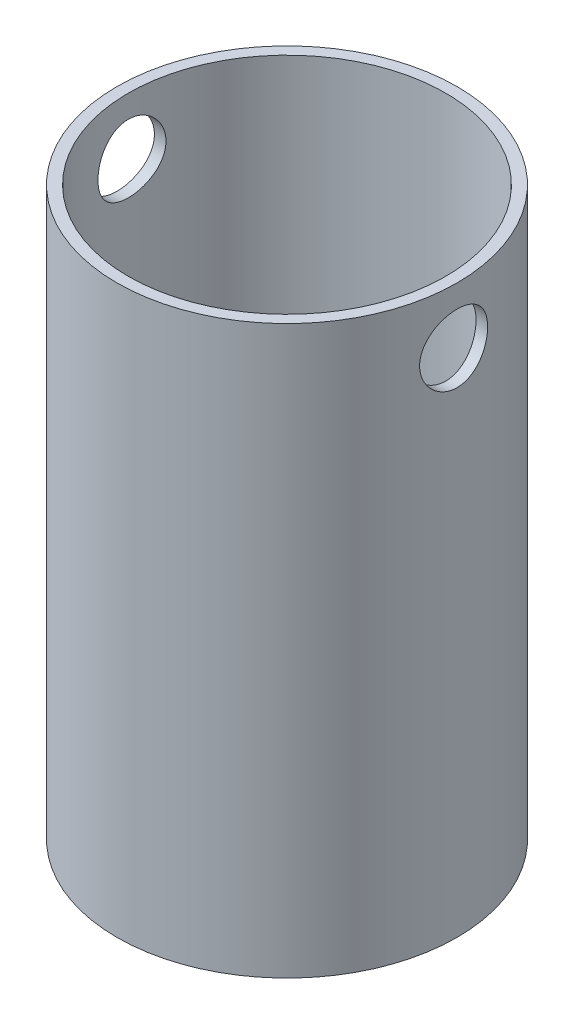
ISO-10303-21;
HEADER;
FILE_DESCRIPTION(('STEP AP214'),'2;1');
FILE_NAME('part.step','',(''),(''),'','','');
FILE_SCHEMA(('AUTOMOTIVE_DESIGN { 1 0 10303 214 1 1 1 1 }'));
ENDSEC;
DATA;
#1=APPLICATION_CONTEXT('core data for automotive mechanical design processes');
#2=APPLICATION_PROTOCOL_DEFINITION('international standard','automotive_design',2000,#1);
#3=PRODUCT_CONTEXT('',#1,'mechanical');
#4=PRODUCT('Part','Part','',(#3));
#5=PRODUCT_RELATED_PRODUCT_CATEGORY('part','',(#4));
#6=PRODUCT_DEFINITION_FORMATION('','',#4);
#7=PRODUCT_DEFINITION_CONTEXT('part definition',#1,'design');
#8=PRODUCT_DEFINITION('design','',#6,#7);
#9=PRODUCT_DEFINITION_SHAPE('','',#8);
#10=(LENGTH_UNIT() NAMED_UNIT(*) SI_UNIT(.MILLI.,.METRE.));
#11=(NAMED_UNIT(*) PLANE_ANGLE_UNIT() SI_UNIT($,.RADIAN.));
#12=(NAMED_UNIT(*) SI_UNIT($,.STERADIAN.) SOLID_ANGLE_UNIT());
#13=UNCERTAINTY_MEASURE_WITH_UNIT(LENGTH_MEASURE(1.E-05),#10,'distance_accuracy_value','');
#14=(GEOMETRIC_REPRESENTATION_CONTEXT(3) GLOBAL_UNCERTAINTY_ASSIGNED_CONTEXT((#13)) GLOBAL_UNIT_ASSIGNED_CONTEXT((#10,
#11,#12)) REPRESENTATION_CONTEXT('',''));
#15=CARTESIAN_POINT('',(0.,0.,0.));
#16=DIRECTION('',(0.,0.,1.));
#17=DIRECTION('',(1.,0.,0.));
#18=AXIS2_PLACEMENT_3D('',#15,#16,#17);
#19=CARTESIAN_POINT('',(0.,50.,0.));
#20=DIRECTION('',(0.,1.,0.));
#21=DIRECTION('',(0.,0.,1.));
#22=AXIS2_PLACEMENT_3D('',#19,#20,#21);
#23=PLANE('',#22);
#24=CARTESIAN_POINT('',(0.,50.,0.));
#25=DIRECTION('',(0.,1.,0.));
#26=DIRECTION('',(0.,0.,1.));
#27=AXIS2_PLACEMENT_3D('',#24,#25,#26);
#28=CIRCLE('',#27,15.);
#29=CARTESIAN_POINT('',(0.,50.,15.));
#30=VERTEX_POINT('',#29);
#31=EDGE_CURVE('E10',#30,#30,#28,.T.);
#32=ORIENTED_EDGE('',*,*,#31,.T.);
#33=EDGE_LOOP('',(#32));
#34=FACE_BOUND('',#33,.T.);
#35=CARTESIAN_POINT('',(0.,50.,0.));
#36=DIRECTION('',(0.,1.,0.));
#37=DIRECTION('',(0.,0.,1.));
#38=AXIS2_PLACEMENT_3D('',#35,#36,#37);
#39=CIRCLE('',#38,14.);
#40=CARTESIAN_POINT('',(0.,50.,14.));
#41=VERTEX_POINT('',#40);
#42=EDGE_CURVE('E59',#41,#41,#39,.T.);
#43=ORIENTED_EDGE('',*,*,#42,.F.);
#44=EDGE_LOOP('',(#43));
#45=FACE_BOUND('',#44,.T.);
#46=ADVANCED_FACE('F40',(#34,#45),#23,.T.);
#47=CARTESIAN_POINT('',(0.,0.,0.));
#48=DIRECTION('',(0.,1.,0.));
#49=DIRECTION('',(0.,0.,1.));
#50=AXIS2_PLACEMENT_3D('',#47,#48,#49);
#51=PLANE('',#50);
#52=CARTESIAN_POINT('',(0.,0.,0.));
#53=DIRECTION('',(0.,1.,0.));
#54=DIRECTION('',(0.,0.,1.));
#55=AXIS2_PLACEMENT_3D('',#52,#53,#54);
#56=CIRCLE('',#55,15.);
#57=CARTESIAN_POINT('',(0.,0.,15.));
#58=VERTEX_POINT('',#57);
#59=EDGE_CURVE('E54',#58,#58,#56,.T.);
#60=ORIENTED_EDGE('',*,*,#59,.F.);
#61=EDGE_LOOP('',(#60));
#62=FACE_BOUND('',#61,.T.);
#63=CARTESIAN_POINT('',(0.,0.,0.));
#64=DIRECTION('',(0.,1.,0.));
#65=DIRECTION('',(0.,0.,1.));
#66=AXIS2_PLACEMENT_3D('',#63,#64,#65);
#67=CIRCLE('',#66,14.);
#68=CARTESIAN_POINT('',(0.,0.,14.));
#69=VERTEX_POINT('',#68);
#70=EDGE_CURVE('E62',#69,#69,#67,.T.);
#71=ORIENTED_EDGE('',*,*,#70,.T.);
#72=EDGE_LOOP('',(#71));
#73=FACE_BOUND('',#72,.T.);
#74=ADVANCED_FACE('F98',(#62,#73),#51,.F.);
#75=CARTESIAN_POINT('',(0.,50.,0.));
#76=DIRECTION('',(0.,-1.,0.));
#77=DIRECTION('',(0.,0.,-1.));
#78=AXIS2_PLACEMENT_3D('',#75,#76,#77);
#79=CYLINDRICAL_SURFACE('',#78,15.);
#80=CARTESIAN_POINT('',(-15.,42.,0.));
#81=CARTESIAN_POINT('',(-14.9999969274261,42.000006133495,-0.1667307203779));
#82=CARTESIAN_POINT('',(-14.9971915553469,42.0139465289029,-0.333538980604568));
#83=CARTESIAN_POINT('',(-14.9862709686969,42.0692955003457,-0.662440523067059));
#84=CARTESIAN_POINT('',(-14.9781515358056,42.1107258984045,-0.824529952624068));
#85=CARTESIAN_POINT('',(-14.9575094783486,42.2197238208624,-1.13919091578994));
#86=CARTESIAN_POINT('',(-14.9449910723015,42.2872663105341,-1.2917714037994));
#87=CARTESIAN_POINT('',(-14.9169119410594,42.4464967425339,-1.58342396659268));
#88=CARTESIAN_POINT('',(-14.9013513970712,42.5381832468216,-1.72249684522744));
#89=CARTESIAN_POINT('',(-14.8686649598991,42.7444154828743,-1.9850804319446));
#90=CARTESIAN_POINT('',(-14.8515223651304,42.8592250661736,-2.10838185347558));
#91=CARTESIAN_POINT('',(-14.8177254135776,43.1078772491751,-2.33411026982409));
#92=CARTESIAN_POINT('',(-14.8010710950127,43.2417213340054,-2.43653563431128));
#93=CARTESIAN_POINT('',(-14.7699732543785,43.5261485790356,-2.61849526004286));
#94=CARTESIAN_POINT('',(-14.7555512209484,43.6768729313891,-2.6978128165976));
#95=CARTESIAN_POINT('',(-14.7307880417525,43.9898454570122,-2.82991699974093));
#96=CARTESIAN_POINT('',(-14.7204464928588,44.152092490039,-2.88270624731172));
#97=CARTESIAN_POINT('',(-14.7051841575661,44.4812530917238,-2.95957589965448));
#98=CARTESIAN_POINT('',(-14.7001941032156,44.6480776324267,-2.98402349387633));
#99=CARTESIAN_POINT('',(-14.6959912518188,44.983529464093,-3.00465638317836));
#100=CARTESIAN_POINT('',(-14.6967778640352,45.1521565689604,-3.0008445681405));
#101=CARTESIAN_POINT('',(-14.7039765344455,45.483740364063,-2.96536371930546));
#102=CARTESIAN_POINT('',(-14.7103035857629,45.6467442168819,-2.93411562073172));
#103=CARTESIAN_POINT('',(-14.7277363848,45.965148229989,-2.84531365386915));
#104=CARTESIAN_POINT('',(-14.7388423607334,46.120548026757,-2.78775852930205));
#105=CARTESIAN_POINT('',(-14.7646685550122,46.4205457851108,-2.64757435102416));
#106=CARTESIAN_POINT('',(-14.7794126944111,46.5650636387075,-2.56477845369634));
#107=CARTESIAN_POINT('',(-14.8108385631919,46.8383125499184,-2.37658072371804));
#108=CARTESIAN_POINT('',(-14.827520515151,46.9670417905535,-2.27117629307049));
#109=CARTESIAN_POINT('',(-14.8613106372439,47.2074882073708,-2.03849980368176));
#110=CARTESIAN_POINT('',(-14.8784210763271,47.3188577035774,-1.91086848363734));
#111=CARTESIAN_POINT('',(-14.9108654614323,47.5186615389037,-1.63855507218603));
#112=CARTESIAN_POINT('',(-14.9261993846692,47.6070955838807,-1.49387276213817));
#113=CARTESIAN_POINT('',(-14.9534007048266,47.7585825276779,-1.19117816063676));
#114=CARTESIAN_POINT('',(-14.9652626654482,47.8215956809336,-1.0331454587559));
#115=CARTESIAN_POINT('',(-14.9841422696357,47.9200814221157,-0.708446929345993));
#116=CARTESIAN_POINT('',(-14.9911605000159,47.9555573462209,-0.541782150217348));
#117=CARTESIAN_POINT('',(-14.999480156006,47.9974693613828,-0.207538216881451));
#118=CARTESIAN_POINT('',(-15.0008752395741,48.0043812586208,-0.040020984976728));
#119=CARTESIAN_POINT('',(-14.9980515579031,47.9902504231735,0.293774802578143));
#120=CARTESIAN_POINT('',(-14.9938331082434,47.9692092619422,0.460053427331381));
#121=CARTESIAN_POINT('',(-14.9803149602405,47.9001648793681,0.785116979839623));
#122=CARTESIAN_POINT('',(-14.9710612921262,47.8524057945063,0.943955845019709));
#123=CARTESIAN_POINT('',(-14.948506561831,47.7315480520326,1.251370882499));
#124=CARTESIAN_POINT('',(-14.9352051964268,47.6584474959695,1.39994628491262));
#125=CARTESIAN_POINT('',(-14.9057973459988,47.4879525280461,1.68462352105865));
#126=CARTESIAN_POINT('',(-14.8896585131116,47.3902716568832,1.82055038025657));
#127=CARTESIAN_POINT('',(-14.8564420448965,47.1737724263782,2.07425405735762));
#128=CARTESIAN_POINT('',(-14.8393643090516,47.0549518008004,2.19202892679229));
#129=CARTESIAN_POINT('',(-14.8058791067089,46.7973799443266,2.40792177232253));
#130=CARTESIAN_POINT('',(-14.7894858069991,46.658352767336,2.50571310734597));
#131=CARTESIAN_POINT('',(-14.7595257538858,46.36556591593,2.67655626015362));
#132=CARTESIAN_POINT('',(-14.7459588874003,46.2118068312793,2.74960906776871));
#133=CARTESIAN_POINT('',(-14.7233022175315,45.8946952615514,2.86845552474588));
#134=CARTESIAN_POINT('',(-14.7141892461656,45.731397476369,2.91439049937315));
#135=CARTESIAN_POINT('',(-14.7014231037608,45.3991996395273,2.97812595488159));
#136=CARTESIAN_POINT('',(-14.6977692207333,45.230300321372,2.99593010467534));
#137=CARTESIAN_POINT('',(-14.6963744889414,44.8949734063671,3.00276273260241));
#138=CARTESIAN_POINT('',(-14.698527575679,44.728556553219,2.99230736421269));
#139=CARTESIAN_POINT('',(-14.7082672045384,44.3999050502849,2.94405691230019));
#140=CARTESIAN_POINT('',(-14.7158537030151,44.2376703669156,2.9062620483879));
#141=CARTESIAN_POINT('',(-14.7355579265748,43.9223168662784,2.80463570549687));
#142=CARTESIAN_POINT('',(-14.7476646305649,43.7691769184928,2.74086752015204));
#143=CARTESIAN_POINT('',(-14.7750514492251,43.4756888377967,2.58916393380482));
#144=CARTESIAN_POINT('',(-14.7903318299668,43.3353417788246,2.50122650632465));
#145=CARTESIAN_POINT('',(-14.8226688156968,43.0688532835491,2.30191774435924));
#146=CARTESIAN_POINT('',(-14.839751187291,42.9429937041972,2.19017366170554));
#147=CARTESIAN_POINT('',(-14.8735824561586,42.7116413834125,1.94719310703942));
#148=CARTESIAN_POINT('',(-14.8903312758955,42.6061533290482,1.81595216146001));
#149=CARTESIAN_POINT('',(-14.9218149716391,42.4174960681607,1.53605288726474));
#150=CARTESIAN_POINT('',(-14.9365269365774,42.3345719901599,1.38722665328951));
#151=CARTESIAN_POINT('',(-14.96205375255,42.1950416322102,1.0774990828222));
#152=CARTESIAN_POINT('',(-14.9728721141585,42.1384116314025,0.916608782589383));
#153=CARTESIAN_POINT('',(-14.9872911778611,42.0640441558659,0.629464466771343));
#154=CARTESIAN_POINT('',(-14.9920290947535,42.0400704188767,0.504844992041358));
#155=CARTESIAN_POINT('',(-14.9983846241968,42.0080462629249,0.253498575630204));
#156=CARTESIAN_POINT('',(-15.0000023361946,41.9999953364707,0.126771701245858));
#157=CARTESIAN_POINT('',(-15.,42.,0.));
#158=B_SPLINE_CURVE_WITH_KNOTS('',3,(#80,#81,#82,#83,#84,#85,#86,#87,#88,#89,#90,#91,#92,#93,
#94,#95,#96,#97,#98,#99,#100,#101,#102,#103,#104,#105,#106,#107,#108,#109,#110,#111,#112,#113,
#114,#115,#116,#117,#118,#119,#120,#121,#122,#123,#124,#125,#126,#127,#128,#129,#130,#131,#132,
#133,#134,#135,#136,#137,#138,#139,#140,#141,#142,#143,#144,#145,#146,#147,#148,#149,#150,#151,
#152,#153,#154,#155,#156,#157),.UNSPECIFIED.,.T.,.F.,(4,2,2,2,2,2,2,2,2,2,2,2,2,2,2,2,2,2,2,2,2,
2,2,2,2,2,2,2,2,2,2,2,2,2,2,2,2,2,4),(0.,0.499728391983776,0.999853952073971,1.49950120575103,
1.99911870669259,2.50479801033657,3.0105167902421,3.52083585017768,4.03110448095593,
4.53468555310762,5.03821512843676,5.53415181018835,6.0301121776119,6.52942470610779,
7.02879464249012,7.53714757474052,8.04550702619462,8.55465824562073,9.06374777094109,
9.56432207028796,10.064868229736,10.5609136185217,11.0569961764807,11.5591519810008,
12.0613616503779,12.5712188573768,13.081055661704,13.5882114309817,14.0953010499125,
14.593191677031,15.0910783047783,15.5877588375933,16.084481027456,16.5896422871743,
17.0949196359879,17.6054849002691,18.1155886655256,18.4955632586968,18.8755257411299),.UNSPECIFIED.);
#159=CARTESIAN_POINT('',(-15.,42.,0.));
#160=VERTEX_POINT('',#159);
#161=EDGE_CURVE('E87',#160,#160,#158,.T.);
#162=ORIENTED_EDGE('',*,*,#161,.T.);
#163=EDGE_LOOP('',(#162));
#164=FACE_BOUND('',#163,.T.);
#165=CARTESIAN_POINT('',(14.6969384566991,45.,-3.));
#166=CARTESIAN_POINT('',(14.6969417707994,44.8333068735265,-2.99999383762582));
#167=CARTESIAN_POINT('',(14.6998052480611,44.66653613,-2.98605951515444));
#168=CARTESIAN_POINT('',(14.7109329391462,44.3377124845706,-2.93073685074853));
#169=CARTESIAN_POINT('',(14.7192014743436,44.1756634660921,-2.88932654121148));
#170=CARTESIAN_POINT('',(14.7401662116556,43.8610880899374,-2.78038734785924));
#171=CARTESIAN_POINT('',(14.7528580086323,43.7085524354022,-2.71288444245786));
#172=CARTESIAN_POINT('',(14.7812339844198,43.4169754659091,-2.55374732301151));
#173=CARTESIAN_POINT('',(14.7969179962038,43.2779333983863,-2.46211445580345));
#174=CARTESIAN_POINT('',(14.8297589908276,43.0153169884384,-2.25593722696031));
#175=CARTESIAN_POINT('',(14.8469321351174,42.8919612363481,-2.14111696773995));
#176=CARTESIAN_POINT('',(14.880674169078,42.6661273992631,-1.89242036706393));
#177=CARTESIAN_POINT('',(14.8972430163249,42.5636507777484,-1.75854269093395));
#178=CARTESIAN_POINT('',(14.9280838925269,42.3816359471146,-1.47408406777277));
#179=CARTESIAN_POINT('',(14.9423346432465,42.3023054585501,-1.32336770301663));
#180=CARTESIAN_POINT('',(14.9667521065089,42.1701751888556,-1.01041245116181));
#181=CARTESIAN_POINT('',(14.9769192013236,42.117372924297,-0.848174644261657));
#182=CARTESIAN_POINT('',(14.9919096206526,42.0404784191411,-0.519050319835482));
#183=CARTESIAN_POINT('',(14.9968015886438,42.016017067287,-0.352253217644441));
#184=CARTESIAN_POINT('',(15.0009276355081,41.9953471444851,-0.0168557053126072));
#185=CARTESIAN_POINT('',(15.0001622595828,41.9991358510625,0.151744529495531));
#186=CARTESIAN_POINT('',(14.9931130460555,42.0345785406467,0.483426002230767));
#187=CARTESIAN_POINT('',(14.9869079509751,42.0658349315035,0.646551642895412));
#188=CARTESIAN_POINT('',(14.9697653147823,42.1546950973767,0.965194879740905));
#189=CARTESIAN_POINT('',(14.9588275843212,42.2122999265756,1.12071217124139));
#190=CARTESIAN_POINT('',(14.9333188805988,42.3525901204418,1.42085838960266));
#191=CARTESIAN_POINT('',(14.9187254452567,42.4354312533147,1.5654125224017));
#192=CARTESIAN_POINT('',(14.8875140842136,42.6237272317098,1.83871513757927));
#193=CARTESIAN_POINT('',(14.8708959256567,42.7291846793116,1.967461798575));
#194=CARTESIAN_POINT('',(14.8371289309338,42.9619008663254,2.20785429316037));
#195=CARTESIAN_POINT('',(14.8199758937255,43.0895075601888,2.3191629497209));
#196=CARTESIAN_POINT('',(14.7873471479628,43.3617493273523,2.51885547953042));
#197=CARTESIAN_POINT('',(14.7718714711364,43.5063847226496,2.60723891918325));
#198=CARTESIAN_POINT('',(14.7443414241877,43.8090624954654,2.75868844440565));
#199=CARTESIAN_POINT('',(14.7322944469065,43.967132902919,2.82169994333313));
#200=CARTESIAN_POINT('',(14.7130942896382,44.291913971172,2.92017102488275));
#201=CARTESIAN_POINT('',(14.7059404718528,44.4586235028573,2.95563419836993));
#202=CARTESIAN_POINT('',(14.6974643780348,44.7928945739971,2.99749801810816));
#203=CARTESIAN_POINT('',(14.6960444117146,44.960392722931,3.00438557669374));
#204=CARTESIAN_POINT('',(14.6989345706656,45.294144669599,2.99021288493222));
#205=CARTESIAN_POINT('',(14.7032443710116,45.4603985373566,2.96915421936733));
#206=CARTESIAN_POINT('',(14.7170169748474,45.7853059208767,2.90010662422247));
#207=CARTESIAN_POINT('',(14.7264299704349,45.9440170291073,2.8523778625179));
#208=CARTESIAN_POINT('',(14.7493046805499,46.2511898370862,2.73162310592556));
#209=CARTESIAN_POINT('',(14.7627667285881,46.3996506913072,2.65859502711953));
#210=CARTESIAN_POINT('',(14.7924421788612,46.6842393298505,2.48821242664679));
#211=CARTESIAN_POINT('',(14.8086891559471,46.8201811389025,2.39055323394826));
#212=CARTESIAN_POINT('',(14.8420117147991,47.0739249360027,2.17408671663814));
#213=CARTESIAN_POINT('',(14.8590873817145,47.1917250547478,2.05527721543361));
#214=CARTESIAN_POINT('',(14.8924603760765,47.4076876775567,1.79769682049367));
#215=CARTESIAN_POINT('',(14.9087417312605,47.50552096395,1.65864749678889));
#216=CARTESIAN_POINT('',(14.9384138288586,47.6764376444988,1.36580368990426));
#217=CARTESIAN_POINT('',(14.9518046926563,47.7495220780343,1.21200982630052));
#218=CARTESIAN_POINT('',(14.974118821832,47.8683866152399,0.894908042472037));
#219=CARTESIAN_POINT('',(14.9830673742781,47.9143215546788,0.731660020434235));
#220=CARTESIAN_POINT('',(14.9955970781298,47.9780737429915,0.399568364039736));
#221=CARTESIAN_POINT('',(14.9991788759955,47.995894378427,0.230725406133636));
#222=CARTESIAN_POINT('',(15.0005562136234,48.0027809428887,-0.104618681710863));
#223=CARTESIAN_POINT('',(14.9984513564799,47.9923418413687,-0.271109436424482));
#224=CARTESIAN_POINT('',(14.9889013068102,47.9440981483565,-0.599913093946951));
#225=CARTESIAN_POINT('',(14.9814561814329,47.9062939009556,-0.762226049261169));
#226=CARTESIAN_POINT('',(14.9620649509476,47.8046130237252,-1.0777582492352));
#227=CARTESIAN_POINT('',(14.9501291174284,47.7407958656071,-1.23099732972049));
#228=CARTESIAN_POINT('',(14.9230416637104,47.5889632760067,-1.52466366055821));
#229=CARTESIAN_POINT('',(14.9078897894096,47.5009459322865,-1.66508989730354));
#230=CARTESIAN_POINT('',(14.8757279747022,47.3015418388161,-1.93159167031775));
#231=CARTESIAN_POINT('',(14.858692002537,47.1898009908487,-2.05739914834453));
#232=CARTESIAN_POINT('',(14.8248366872359,46.9468492797037,-2.28864785327552));
#233=CARTESIAN_POINT('',(14.8080173963616,46.8156338115602,-2.39408424962674));
#234=CARTESIAN_POINT('',(14.7763002820179,46.5357620499287,-2.58267665834995));
#235=CARTESIAN_POINT('',(14.7614251071368,46.3869331166362,-2.66558044385427));
#236=CARTESIAN_POINT('',(14.7355571137924,46.0772016802197,-2.80507214779868));
#237=CARTESIAN_POINT('',(14.7245607757495,45.9163102839384,-2.86168393792249));
#238=CARTESIAN_POINT('',(14.7098904341354,45.6292126336714,-2.93600741957297));
#239=CARTESIAN_POINT('',(14.7050635474382,45.5046437414581,-2.95996169557106));
#240=CARTESIAN_POINT('',(14.6985863537725,45.2533981363466,-2.99196005387914));
#241=CARTESIAN_POINT('',(14.6969359372925,45.1267214962666,-3.00000468468793));
#242=CARTESIAN_POINT('',(14.6969384566991,45.,-3.));
#243=B_SPLINE_CURVE_WITH_KNOTS('',3,(#165,#166,#167,#168,#169,#170,#171,#172,#173,#174,#175,
#176,#177,#178,#179,#180,#181,#182,#183,#184,#185,#186,#187,#188,#189,#190,#191,#192,#193,#194,
#195,#196,#197,#198,#199,#200,#201,#202,#203,#204,#205,#206,#207,#208,#209,#210,#211,#212,#213,
#214,#215,#216,#217,#218,#219,#220,#221,#222,#223,#224,#225,#226,#227,#228,#229,#230,#231,#232,
#233,#234,#235,#236,#237,#238,#239,#240,#241,#242),.UNSPECIFIED.,.T.,.F.,(4,2,2,2,2,2,2,2,2,2,2,
2,2,2,2,2,2,2,2,2,2,2,2,2,2,2,2,2,2,2,2,2,2,2,2,2,2,2,4),(0.,0.499615391608283,
0.999630717852891,1.49914949382176,1.99864039457959,2.5044675764531,3.01033020106266,
3.52060201312351,4.0308260473968,4.53432746649242,5.03778036348745,5.53406368900613,
6.03036687221251,6.5297977266691,7.02928607310199,7.5374804028745,8.04568434368162,
8.55497589518331,9.06420105048075,9.56471273413781,10.0651960358526,10.5608802534996,
11.056605310632,11.5587917932356,12.0610299861063,12.5709780520035,13.0809046989032,
13.5878944073595,14.0948230407488,14.5929305224406,15.0910317410027,15.5880005122636,
16.0850085640405,16.5900345607679,17.0951801666934,17.6057669573882,18.115889252706,
18.4957141091449,18.8755258705644),.UNSPECIFIED.);
#244=CARTESIAN_POINT('',(14.6969384566991,45.,-3.));
#245=VERTEX_POINT('',#244);
#246=EDGE_CURVE('E82',#245,#245,#243,.T.);
#247=ORIENTED_EDGE('',*,*,#246,.T.);
#248=EDGE_LOOP('',(#247));
#249=FACE_BOUND('',#248,.T.);
#250=ORIENTED_EDGE('',*,*,#31,.F.);
#251=EDGE_LOOP('',(#250));
#252=FACE_BOUND('',#251,.T.);
#253=ORIENTED_EDGE('',*,*,#59,.T.);
#254=EDGE_LOOP('',(#253));
#255=FACE_BOUND('',#254,.T.);
#256=ADVANCED_FACE('F42',(#164,#249,#252,#255),#79,.T.);
#257=CARTESIAN_POINT('',(0.,50.,0.));
#258=DIRECTION('',(0.,-1.,0.));
#259=DIRECTION('',(0.,0.,-1.));
#260=AXIS2_PLACEMENT_3D('',#257,#258,#259);
#261=CYLINDRICAL_SURFACE('',#260,14.);
#262=CARTESIAN_POINT('',(-13.6747943311773,45.,-3.));
#263=CARTESIAN_POINT('',(-13.6747976912119,45.166422304966,-2.99999416477353));
#264=CARTESIAN_POINT('',(-13.6778654468474,45.3329155478848,-2.9861047248957));
#265=CARTESIAN_POINT('',(-13.6897835685885,45.6611733444834,-2.93097118505965));
#266=CARTESIAN_POINT('',(-13.6986382242345,45.8229342973523,-2.88970679307235));
#267=CARTESIAN_POINT('',(-13.7210823058705,46.1369314991486,-2.78117727369208));
#268=CARTESIAN_POINT('',(-13.7346666545171,46.289177756243,-2.71394001982631));
#269=CARTESIAN_POINT('',(-13.7650334169723,46.5802305478892,-2.55545235346679));
#270=CARTESIAN_POINT('',(-13.7818157375507,46.7190374740581,-2.46420264097551));
#271=CARTESIAN_POINT('',(-13.8169915759332,46.9815259229643,-2.25870285140442));
#272=CARTESIAN_POINT('',(-13.8354049974351,47.1049577524799,-2.14413718967966));
#273=CARTESIAN_POINT('',(-13.8715938342079,47.3310071088116,-1.89593901625916));
#274=CARTESIAN_POINT('',(-13.8893692010283,47.4336230577201,-1.76230506043536));
#275=CARTESIAN_POINT('',(-13.9224953821886,47.6161108889829,-1.47809457692917));
#276=CARTESIAN_POINT('',(-13.9378199763886,47.6957433115412,-1.32736097645991));
#277=CARTESIAN_POINT('',(-13.9640934208587,47.8284553828926,-1.01426853868519));
#278=CARTESIAN_POINT('',(-13.9750427420666,47.8815378895726,-0.851910954760626));
#279=CARTESIAN_POINT('',(-13.9911913056236,47.9588599418627,-0.522774375343024));
#280=CARTESIAN_POINT('',(-13.9964746675677,47.9835218571049,-0.356098801193847));
#281=CARTESIAN_POINT('',(-14.00098724414,48.0046225546265,-0.0208978906132893));
#282=CARTESIAN_POINT('',(-14.000217124654,48.0010644411215,0.147627240329518));
#283=CARTESIAN_POINT('',(-13.9927740172512,47.9661420706728,0.478834058501024));
#284=CARTESIAN_POINT('',(-13.9861976630486,47.9352329994202,0.641566230724226));
#285=CARTESIAN_POINT('',(-13.9679908317821,47.8472106362963,0.959478927956778));
#286=CARTESIAN_POINT('',(-13.9563601323304,47.7900961914005,1.11465912035011));
#287=CARTESIAN_POINT('',(-13.9291950929372,47.650877082223,1.4143349951131));
#288=CARTESIAN_POINT('',(-13.9136337160789,47.5685984655913,1.55874731403158));
#289=CARTESIAN_POINT('',(-13.8803158748773,47.3815160636728,1.83188185312569));
#290=CARTESIAN_POINT('',(-13.8625591228939,47.2767093253994,1.96060201290306));
#291=CARTESIAN_POINT('',(-13.8263865292185,47.0450629109443,2.20140417600396));
#292=CARTESIAN_POINT('',(-13.8079646074571,46.9178248412859,2.31310234640501));
#293=CARTESIAN_POINT('',(-13.7728713366395,46.646233429863,2.51364486469456));
#294=CARTESIAN_POINT('',(-13.7562000312677,46.5018796611895,2.60248864236137));
#295=CARTESIAN_POINT('',(-13.7264804717345,46.1995509978725,2.75496155146593));
#296=CARTESIAN_POINT('',(-13.7134423025555,46.0415397522951,2.81852070177846));
#297=CARTESIAN_POINT('',(-13.6926068161323,45.7167344681071,2.91806990318231));
#298=CARTESIAN_POINT('',(-13.6848087043697,45.5499417651136,2.95406413389256));
#299=CARTESIAN_POINT('',(-13.6754976251089,45.2158084947006,2.99687172049304));
#300=CARTESIAN_POINT('',(-13.673864541034,45.0485426498454,3.00424283857281));
#301=CARTESIAN_POINT('',(-13.6767447914799,44.7151720136366,2.99110279284747));
#302=CARTESIAN_POINT('',(-13.6812577220213,44.5490671466929,2.9705934616327));
#303=CARTESIAN_POINT('',(-13.6958083096841,44.2246591300385,2.90275789271169));
#304=CARTESIAN_POINT('',(-13.7057831054873,44.0662891348061,2.85573660503107));
#305=CARTESIAN_POINT('',(-13.7300771973955,43.7596753249342,2.73654105893499));
#306=CARTESIAN_POINT('',(-13.744396895457,43.6114324487316,2.66436447325636));
#307=CARTESIAN_POINT('',(-13.7760326816069,43.3268606304822,2.4956700883341));
#308=CARTESIAN_POINT('',(-13.7933900349263,43.1907408359756,2.39880737181585));
#309=CARTESIAN_POINT('',(-13.8290355072028,42.9364833082524,2.18394367667202));
#310=CARTESIAN_POINT('',(-13.8473237366892,42.8183477171031,2.06594018364322));
#311=CARTESIAN_POINT('',(-13.8831647998035,42.6012593941105,1.80962552884163));
#312=CARTESIAN_POINT('',(-13.9006987121549,42.502686167686,1.67098985165754));
#313=CARTESIAN_POINT('',(-13.932712214298,42.3302291812979,1.37880296256455));
#314=CARTESIAN_POINT('',(-13.9471919435339,42.2563442940543,1.22525243208748));
#315=CARTESIAN_POINT('',(-13.9713855676315,42.135895890723,0.908530837964083));
#316=CARTESIAN_POINT('',(-13.9811288760739,42.0891633925074,0.74542638615035));
#317=CARTESIAN_POINT('',(-13.9948787860397,42.0238165885354,0.41345035400658));
#318=CARTESIAN_POINT('',(-13.9988861862461,42.0051983680522,0.24457957994798));
#319=CARTESIAN_POINT('',(-14.000690220181,41.9967786951763,-0.0905274341056502));
#320=CARTESIAN_POINT('',(-13.9986091800327,42.0064096827907,-0.25674901101843));
#321=CARTESIAN_POINT('',(-13.9887310472683,42.0529495270381,-0.58514587683195));
#322=CARTESIAN_POINT('',(-13.9809340494761,42.0898579311568,-0.747321232810676));
#323=CARTESIAN_POINT('',(-13.9605077727683,42.1896376124988,-1.06260389697443));
#324=CARTESIAN_POINT('',(-13.9478929286009,42.2524313787704,-1.21573673014596));
#325=CARTESIAN_POINT('',(-13.9191807210222,42.4021225423389,-1.50936991344683));
#326=CARTESIAN_POINT('',(-13.9030830344402,42.4890221766146,-1.64986908959375));
#327=CARTESIAN_POINT('',(-13.8687961986559,42.6863246374827,-1.917024613789));
#328=CARTESIAN_POINT('',(-13.8505741780296,42.7971283166328,-2.04338073020593));
#329=CARTESIAN_POINT('',(-13.8142738016446,43.0382812205105,-2.27590002915847));
#330=CARTESIAN_POINT('',(-13.7961954813912,43.1686351267478,-2.38205836126942));
#331=CARTESIAN_POINT('',(-13.761973872554,43.4471809863392,-2.57246523191562));
#332=CARTESIAN_POINT('',(-13.7458581173137,43.5955787164454,-2.65641795611844));
#333=CARTESIAN_POINT('',(-13.7177299427787,43.9046874417168,-2.79806009312271));
#334=CARTESIAN_POINT('',(-13.7057139912142,44.0653876904718,-2.8557721284606));
#335=CARTESIAN_POINT('',(-13.6894112131582,44.3552522623923,-2.93277214244342));
#336=CARTESIAN_POINT('',(-13.683965661845,44.4828233514212,-2.95793505015818));
#337=CARTESIAN_POINT('',(-13.6766559900021,44.7402486231491,-2.99155088086543));
#338=CARTESIAN_POINT('',(-13.6747917085757,44.870102703015,-3.00000455455864));
#339=CARTESIAN_POINT('',(-13.6747943311773,45.,-3.));
#340=B_SPLINE_CURVE_WITH_KNOTS('',3,(#262,#263,#264,#265,#266,#267,#268,#269,#270,#271,#272,
#273,#274,#275,#276,#277,#278,#279,#280,#281,#282,#283,#284,#285,#286,#287,#288,#289,#290,#291,
#292,#293,#294,#295,#296,#297,#298,#299,#300,#301,#302,#303,#304,#305,#306,#307,#308,#309,#310,
#311,#312,#313,#314,#315,#316,#317,#318,#319,#320,#321,#322,#323,#324,#325,#326,#327,#328,#329,
#330,#331,#332,#333,#334,#335,#336,#337,#338,#339),.UNSPECIFIED.,.T.,.F.,(4,2,2,2,2,2,2,2,2,2,2,
2,2,2,2,2,2,2,2,2,2,2,2,2,2,2,2,2,2,2,2,2,2,2,2,2,2,2,4),(0.,0.498790964055061,
0.997952076959928,1.49657898230552,1.99519135347057,2.50106459165384,3.00697616225757,
3.51798269640556,4.02893421292535,4.53219016303858,5.03539075554482,5.53037115334743,
6.02537333215168,6.52387776286874,7.0224475774463,7.5309792155859,8.03952354046184,
8.54946574823563,9.05933061907678,9.55920866385047,10.0590538530783,10.5532636149875,
11.047519111263,11.5491002043264,12.0507409931816,12.5613242936642,13.0718842775108,
13.5792317964875,14.0865086641708,14.5836639928825,15.080811074302,15.5764801923897,
16.0721953230273,16.5769782832193,17.0818823126247,17.593207603363,18.1040912322742,
18.4934291224859,18.8827495204009),.UNSPECIFIED.);
#341=CARTESIAN_POINT('',(-13.6747943311773,45.,-3.));
#342=VERTEX_POINT('',#341);
#343=EDGE_CURVE('E45',#342,#342,#340,.T.);
#344=ORIENTED_EDGE('',*,*,#343,.F.);
#345=EDGE_LOOP('',(#344));
#346=FACE_BOUND('',#345,.T.);
#347=CARTESIAN_POINT('',(13.6747943311773,45.,-3.));
#348=CARTESIAN_POINT('',(13.6747976912119,44.833577695034,-2.99999416477353));
#349=CARTESIAN_POINT('',(13.6778654468474,44.6670844521152,-2.9861047248957));
#350=CARTESIAN_POINT('',(13.6897835685885,44.3388266555166,-2.93097118505965));
#351=CARTESIAN_POINT('',(13.6986382242345,44.1770657026477,-2.88970679307235));
#352=CARTESIAN_POINT('',(13.7210823058705,43.8630685008514,-2.78117727369208));
#353=CARTESIAN_POINT('',(13.7346666545171,43.710822243757,-2.71394001982631));
#354=CARTESIAN_POINT('',(13.7650334169723,43.4197694521108,-2.55545235346679));
#355=CARTESIAN_POINT('',(13.7818157375507,43.2809625259419,-2.46420264097551));
#356=CARTESIAN_POINT('',(13.8169915759332,43.0184740770357,-2.25870285140442));
#357=CARTESIAN_POINT('',(13.8354049974351,42.8950422475201,-2.14413718967966));
#358=CARTESIAN_POINT('',(13.8715938342079,42.6689928911884,-1.89593901625916));
#359=CARTESIAN_POINT('',(13.8893692010283,42.5663769422799,-1.76230506043536));
#360=CARTESIAN_POINT('',(13.9224953821886,42.3838891110171,-1.47809457692917));
#361=CARTESIAN_POINT('',(13.9378199763886,42.3042566884588,-1.32736097645991));
#362=CARTESIAN_POINT('',(13.9640934208587,42.1715446171074,-1.01426853868519));
#363=CARTESIAN_POINT('',(13.9750427420666,42.1184621104274,-0.851910954760625));
#364=CARTESIAN_POINT('',(13.9911913056236,42.0411400581373,-0.522774375343024));
#365=CARTESIAN_POINT('',(13.9964746675677,42.0164781428951,-0.356098801193847));
#366=CARTESIAN_POINT('',(14.00098724414,41.9953774453735,-0.0208978906132896));
#367=CARTESIAN_POINT('',(14.000217124654,41.9989355588785,0.147627240329518));
#368=CARTESIAN_POINT('',(13.9927740172512,42.0338579293272,0.478834058501023));
#369=CARTESIAN_POINT('',(13.9861976630486,42.0647670005798,0.641566230724224));
#370=CARTESIAN_POINT('',(13.9679908317821,42.1527893637037,0.959478927956778));
#371=CARTESIAN_POINT('',(13.9563601323304,42.2099038085995,1.11465912035011));
#372=CARTESIAN_POINT('',(13.9291950929372,42.349122917777,1.41433499511311));
#373=CARTESIAN_POINT('',(13.9136337160789,42.4314015344087,1.55874731403158));
#374=CARTESIAN_POINT('',(13.8803158748773,42.6184839363272,1.83188185312569));
#375=CARTESIAN_POINT('',(13.8625591228939,42.7232906746006,1.96060201290306));
#376=CARTESIAN_POINT('',(13.8263865292185,42.9549370890557,2.20140417600396));
#377=CARTESIAN_POINT('',(13.8079646074571,43.0821751587141,2.31310234640501));
#378=CARTESIAN_POINT('',(13.7728713366395,43.353766570137,2.51364486469456));
#379=CARTESIAN_POINT('',(13.7562000312677,43.4981203388105,2.60248864236137));
#380=CARTESIAN_POINT('',(13.7264804717345,43.8004490021275,2.75496155146593));
#381=CARTESIAN_POINT('',(13.7134423025555,43.9584602477049,2.81852070177846));
#382=CARTESIAN_POINT('',(13.6926068161323,44.2832655318929,2.91806990318231));
#383=CARTESIAN_POINT('',(13.6848087043697,44.4500582348864,2.95406413389256));
#384=CARTESIAN_POINT('',(13.6754976251089,44.7841915052994,2.99687172049304));
#385=CARTESIAN_POINT('',(13.673864541034,44.9514573501546,3.00424283857281));
#386=CARTESIAN_POINT('',(13.6767447914799,45.2848279863634,2.99110279284747));
#387=CARTESIAN_POINT('',(13.6812577220213,45.4509328533071,2.9705934616327));
#388=CARTESIAN_POINT('',(13.6958083096841,45.7753408699615,2.90275789271169));
#389=CARTESIAN_POINT('',(13.7057831054873,45.9337108651939,2.85573660503107));
#390=CARTESIAN_POINT('',(13.7300771973955,46.2403246750658,2.73654105893499));
#391=CARTESIAN_POINT('',(13.744396895457,46.3885675512684,2.66436447325637));
#392=CARTESIAN_POINT('',(13.7760326816069,46.6731393695178,2.4956700883341));
#393=CARTESIAN_POINT('',(13.7933900349263,46.8092591640244,2.39880737181584));
#394=CARTESIAN_POINT('',(13.8290355072028,47.0635166917476,2.18394367667201));
#395=CARTESIAN_POINT('',(13.8473237366892,47.1816522828969,2.06594018364322));
#396=CARTESIAN_POINT('',(13.8831647998035,47.3987406058895,1.80962552884163));
#397=CARTESIAN_POINT('',(13.9006987121549,47.497313832314,1.67098985165754));
#398=CARTESIAN_POINT('',(13.932712214298,47.6697708187021,1.37880296256455));
#399=CARTESIAN_POINT('',(13.9471919435339,47.7436557059457,1.22525243208748));
#400=CARTESIAN_POINT('',(13.9713855676315,47.864104109277,0.908530837964083));
#401=CARTESIAN_POINT('',(13.9811288760739,47.9108366074926,0.745426386150349));
#402=CARTESIAN_POINT('',(13.9948787860397,47.9761834114646,0.413450354006579));
#403=CARTESIAN_POINT('',(13.9988861862461,47.9948016319478,0.24457957994798));
#404=CARTESIAN_POINT('',(14.000690220181,48.0032213048237,-0.0905274341056501));
#405=CARTESIAN_POINT('',(13.9986091800327,47.9935903172093,-0.25674901101843));
#406=CARTESIAN_POINT('',(13.9887310472683,47.9470504729619,-0.58514587683195));
#407=CARTESIAN_POINT('',(13.9809340494761,47.9101420688432,-0.747321232810676));
#408=CARTESIAN_POINT('',(13.9605077727683,47.8103623875012,-1.06260389697443));
#409=CARTESIAN_POINT('',(13.9478929286009,47.7475686212296,-1.21573673014596));
#410=CARTESIAN_POINT('',(13.9191807210222,47.5978774576611,-1.50936991344683));
#411=CARTESIAN_POINT('',(13.9030830344402,47.5109778233854,-1.64986908959375));
#412=CARTESIAN_POINT('',(13.8687961986559,47.3136753625173,-1.917024613789));
#413=CARTESIAN_POINT('',(13.8505741780296,47.2028716833672,-2.04338073020593));
#414=CARTESIAN_POINT('',(13.8142738016446,46.9617187794895,-2.27590002915847));
#415=CARTESIAN_POINT('',(13.7961954813912,46.8313648732522,-2.38205836126942));
#416=CARTESIAN_POINT('',(13.761973872554,46.5528190136608,-2.57246523191562));
#417=CARTESIAN_POINT('',(13.7458581173137,46.4044212835546,-2.65641795611844));
#418=CARTESIAN_POINT('',(13.7177299427787,46.0953125582832,-2.79806009312271));
#419=CARTESIAN_POINT('',(13.7057139912142,45.9346123095282,-2.8557721284606));
#420=CARTESIAN_POINT('',(13.6894112131582,45.6447477376077,-2.93277214244342));
#421=CARTESIAN_POINT('',(13.683965661845,45.5171766485788,-2.95793505015818));
#422=CARTESIAN_POINT('',(13.6766559900021,45.2597513768509,-2.99155088086543));
#423=CARTESIAN_POINT('',(13.6747917085757,45.129897296985,-3.00000455455864));
#424=CARTESIAN_POINT('',(13.6747943311773,45.,-3.));
#425=B_SPLINE_CURVE_WITH_KNOTS('',3,(#347,#348,#349,#350,#351,#352,#353,#354,#355,#356,#357,
#358,#359,#360,#361,#362,#363,#364,#365,#366,#367,#368,#369,#370,#371,#372,#373,#374,#375,#376,
#377,#378,#379,#380,#381,#382,#383,#384,#385,#386,#387,#388,#389,#390,#391,#392,#393,#394,#395,
#396,#397,#398,#399,#400,#401,#402,#403,#404,#405,#406,#407,#408,#409,#410,#411,#412,#413,#414,
#415,#416,#417,#418,#419,#420,#421,#422,#423,#424),.UNSPECIFIED.,.T.,.F.,(4,2,2,2,2,2,2,2,2,2,2,
2,2,2,2,2,2,2,2,2,2,2,2,2,2,2,2,2,2,2,2,2,2,2,2,2,2,2,4),(0.,0.498790964055054,
0.997952076959928,1.49657898230552,1.99519135347057,2.50106459165384,3.00697616225757,
3.51798269640557,4.02893421292535,4.53219016303857,5.03539075554482,5.53037115334743,
6.02537333215168,6.52387776286874,7.02244757744629,7.5309792155859,8.03952354046184,
8.54946574823562,9.05933061907678,9.55920866385046,10.0590538530783,10.5532636149875,
11.047519111263,11.5491002043264,12.0507409931816,12.5613242936642,13.0718842775108,
13.5792317964875,14.0865086641708,14.5836639928825,15.080811074302,15.5764801923897,
16.0721953230273,16.5769782832193,17.0818823126247,17.593207603363,18.1040912322742,
18.4934291224859,18.8827495204009),.UNSPECIFIED.);
#426=CARTESIAN_POINT('',(13.6747943311773,45.,-3.));
#427=VERTEX_POINT('',#426);
#428=EDGE_CURVE('E64',#427,#427,#425,.T.);
#429=ORIENTED_EDGE('',*,*,#428,.F.);
#430=EDGE_LOOP('',(#429));
#431=FACE_BOUND('',#430,.T.);
#432=ORIENTED_EDGE('',*,*,#42,.T.);
#433=EDGE_LOOP('',(#432));
#434=FACE_BOUND('',#433,.T.);
#435=ORIENTED_EDGE('',*,*,#70,.F.);
#436=EDGE_LOOP('',(#435));
#437=FACE_BOUND('',#436,.T.);
#438=ADVANCED_FACE('F69',(#346,#431,#434,#437),#261,.F.);
#439=CARTESIAN_POINT('',(-15.,45.,0.));
#440=DIRECTION('',(1.,0.,0.));
#441=DIRECTION('',(0.,0.,-1.));
#442=AXIS2_PLACEMENT_3D('',#439,#440,#441);
#443=CYLINDRICAL_SURFACE('',#442,3.);
#444=ORIENTED_EDGE('',*,*,#428,.T.);
#445=EDGE_LOOP('',(#444));
#446=FACE_BOUND('',#445,.T.);
#447=ORIENTED_EDGE('',*,*,#246,.F.);
#448=EDGE_LOOP('',(#447));
#449=FACE_BOUND('',#448,.T.);
#450=ADVANCED_FACE('F75',(#446,#449),#443,.F.);
#451=ORIENTED_EDGE('',*,*,#343,.T.);
#452=EDGE_LOOP('',(#451));
#453=FACE_BOUND('',#452,.T.);
#454=ORIENTED_EDGE('',*,*,#161,.F.);
#455=EDGE_LOOP('',(#454));
#456=FACE_BOUND('',#455,.T.);
#457=ADVANCED_FACE('F72',(#453,#456),#443,.F.);
#458=CLOSED_SHELL('',(#46,#74,#256,#438,#450,#457));
#459=MANIFOLD_SOLID_BREP('B2',#458);
#460=ADVANCED_BREP_SHAPE_REPRESENTATION('',(#18,#459),#14);
#461=SHAPE_DEFINITION_REPRESENTATION(#9,#460);
ENDSEC;
END-ISO-10303-21;
